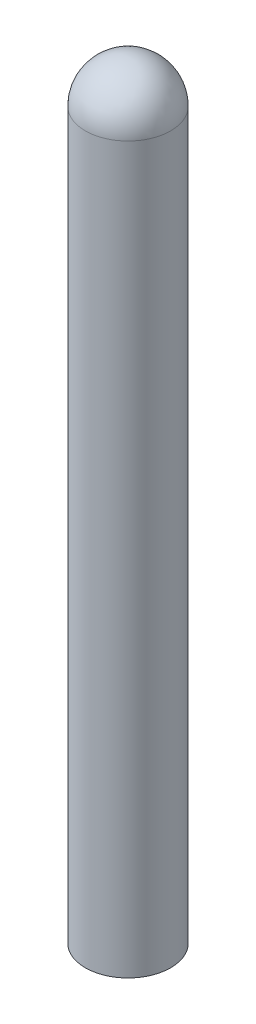
ISO-10303-21;
HEADER;
FILE_DESCRIPTION(('STEP AP214'),'2;1');
FILE_NAME('part.step','',(''),(''),'','','');
FILE_SCHEMA(('AUTOMOTIVE_DESIGN { 1 0 10303 214 1 1 1 1 }'));
ENDSEC;
DATA;
#1=APPLICATION_CONTEXT('core data for automotive mechanical design processes');
#2=APPLICATION_PROTOCOL_DEFINITION('international standard','automotive_design',2000,#1);
#3=PRODUCT_CONTEXT('',#1,'mechanical');
#4=PRODUCT('Part','Part','',(#3));
#5=PRODUCT_RELATED_PRODUCT_CATEGORY('part','',(#4));
#6=PRODUCT_DEFINITION_FORMATION('','',#4);
#7=PRODUCT_DEFINITION_CONTEXT('part definition',#1,'design');
#8=PRODUCT_DEFINITION('design','',#6,#7);
#9=PRODUCT_DEFINITION_SHAPE('','',#8);
#10=(LENGTH_UNIT() NAMED_UNIT(*) SI_UNIT(.MILLI.,.METRE.));
#11=(NAMED_UNIT(*) PLANE_ANGLE_UNIT() SI_UNIT($,.RADIAN.));
#12=(NAMED_UNIT(*) SI_UNIT($,.STERADIAN.) SOLID_ANGLE_UNIT());
#13=UNCERTAINTY_MEASURE_WITH_UNIT(LENGTH_MEASURE(1.E-05),#10,'distance_accuracy_value','');
#14=(GEOMETRIC_REPRESENTATION_CONTEXT(3) GLOBAL_UNCERTAINTY_ASSIGNED_CONTEXT((#13)) GLOBAL_UNIT_ASSIGNED_CONTEXT((#10,
#11,#12)) REPRESENTATION_CONTEXT('',''));
#15=CARTESIAN_POINT('',(0.,0.,0.));
#16=DIRECTION('',(0.,0.,1.));
#17=DIRECTION('',(1.,0.,0.));
#18=AXIS2_PLACEMENT_3D('',#15,#16,#17);
#19=CARTESIAN_POINT('',(0.,57.15,0.));
#20=DIRECTION('',(0.,-1.,0.));
#21=DIRECTION('',(0.,0.,-1.));
#22=AXIS2_PLACEMENT_3D('',#19,#20,#21);
#23=CYLINDRICAL_SURFACE('',#22,3.175);
#24=CARTESIAN_POINT('',(0.,53.975,0.));
#25=DIRECTION('',(0.,-1.,0.));
#26=DIRECTION('',(0.,0.,-1.));
#27=AXIS2_PLACEMENT_3D('',#24,#25,#26);
#28=CIRCLE('',#27,3.175);
#29=CARTESIAN_POINT('',(0.,53.975,-3.175));
#30=VERTEX_POINT('',#29);
#31=EDGE_CURVE('E10',#30,#30,#28,.T.);
#32=ORIENTED_EDGE('',*,*,#31,.T.);
#33=EDGE_LOOP('',(#32));
#34=FACE_BOUND('',#33,.T.);
#35=CARTESIAN_POINT('',(0.,0.,0.));
#36=DIRECTION('',(0.,1.,0.));
#37=DIRECTION('',(0.,0.,1.));
#38=AXIS2_PLACEMENT_3D('',#35,#36,#37);
#39=CIRCLE('',#38,3.175);
#40=CARTESIAN_POINT('',(0.,0.,3.175));
#41=VERTEX_POINT('',#40);
#42=EDGE_CURVE('E38',#41,#41,#39,.T.);
#43=ORIENTED_EDGE('',*,*,#42,.T.);
#44=EDGE_LOOP('',(#43));
#45=FACE_BOUND('',#44,.T.);
#46=ADVANCED_FACE('F31',(#34,#45),#23,.T.);
#47=CARTESIAN_POINT('',(0.,0.,0.));
#48=DIRECTION('',(0.,1.,0.));
#49=DIRECTION('',(0.,0.,1.));
#50=AXIS2_PLACEMENT_3D('',#47,#48,#49);
#51=PLANE('',#50);
#52=ORIENTED_EDGE('',*,*,#42,.F.);
#53=EDGE_LOOP('',(#52));
#54=FACE_BOUND('',#53,.T.);
#55=ADVANCED_FACE('F45',(#54),#51,.F.);
#56=CARTESIAN_POINT('',(0.,53.975,0.));
#57=DIRECTION('',(0.,1.,0.));
#58=DIRECTION('',(0.,0.,1.));
#59=AXIS2_PLACEMENT_3D('',#56,#57,#58);
#60=SPHERICAL_SURFACE('',#59,3.175);
#61=ORIENTED_EDGE('',*,*,#31,.F.);
#62=EDGE_LOOP('',(#61));
#63=FACE_BOUND('',#62,.T.);
#64=ADVANCED_FACE('F33',(#63),#60,.T.);
#65=CLOSED_SHELL('',(#46,#55,#64));
#66=MANIFOLD_SOLID_BREP('B2',#65);
#67=ADVANCED_BREP_SHAPE_REPRESENTATION('',(#18,#66),#14);
#68=SHAPE_DEFINITION_REPRESENTATION(#9,#67);
ENDSEC;
END-ISO-10303-21;
